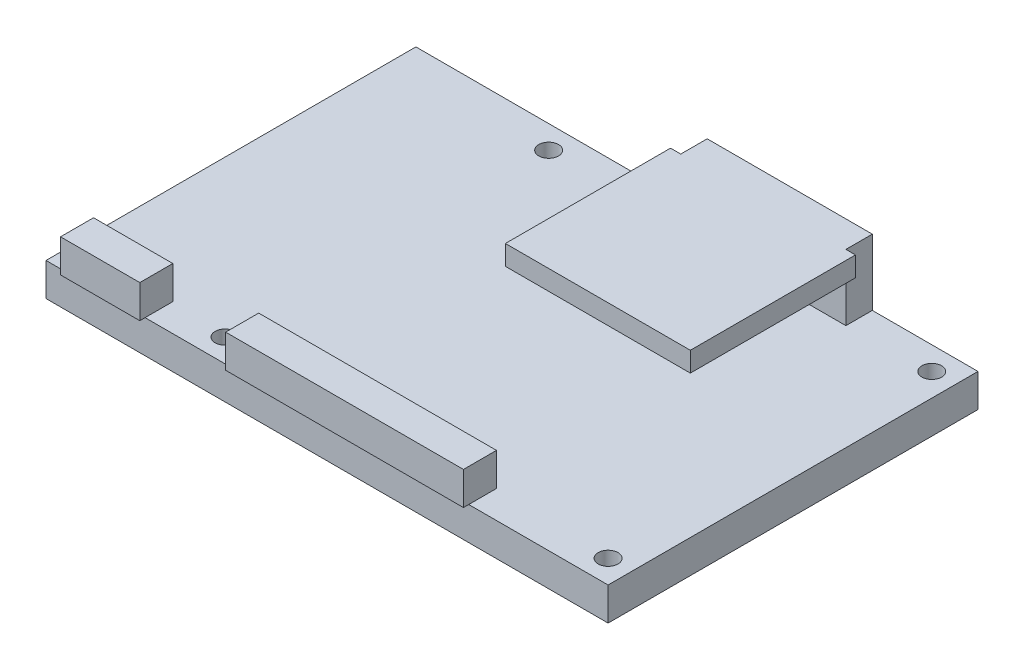
ISO-10303-21;
HEADER;
FILE_DESCRIPTION(('STEP AP214'),'2;1');
FILE_NAME('part.step','',(''),(''),'','','');
FILE_SCHEMA(('AUTOMOTIVE_DESIGN { 1 0 10303 214 1 1 1 1 }'));
ENDSEC;
DATA;
#1=APPLICATION_CONTEXT('core data for automotive mechanical design processes');
#2=APPLICATION_PROTOCOL_DEFINITION('international standard','automotive_design',2000,#1);
#3=PRODUCT_CONTEXT('',#1,'mechanical');
#4=PRODUCT('Part','Part','',(#3));
#5=PRODUCT_RELATED_PRODUCT_CATEGORY('part','',(#4));
#6=PRODUCT_DEFINITION_FORMATION('','',#4);
#7=PRODUCT_DEFINITION_CONTEXT('part definition',#1,'design');
#8=PRODUCT_DEFINITION('design','',#6,#7);
#9=PRODUCT_DEFINITION_SHAPE('','',#8);
#10=(LENGTH_UNIT() NAMED_UNIT(*) SI_UNIT(.MILLI.,.METRE.));
#11=(NAMED_UNIT(*) PLANE_ANGLE_UNIT() SI_UNIT($,.RADIAN.));
#12=(NAMED_UNIT(*) SI_UNIT($,.STERADIAN.) SOLID_ANGLE_UNIT());
#13=UNCERTAINTY_MEASURE_WITH_UNIT(LENGTH_MEASURE(1.E-05),#10,'distance_accuracy_value','');
#14=(GEOMETRIC_REPRESENTATION_CONTEXT(3) GLOBAL_UNCERTAINTY_ASSIGNED_CONTEXT((#13)) GLOBAL_UNIT_ASSIGNED_CONTEXT((#10,
#11,#12)) REPRESENTATION_CONTEXT('',''));
#15=CARTESIAN_POINT('',(0.,0.,0.));
#16=DIRECTION('',(0.,0.,1.));
#17=DIRECTION('',(1.,0.,0.));
#18=AXIS2_PLACEMENT_3D('',#15,#16,#17);
#19=CARTESIAN_POINT('',(1.55000000000002,15.,-24.));
#20=DIRECTION('',(0.,0.,-1.));
#21=DIRECTION('',(-1.,0.,0.));
#22=AXIS2_PLACEMENT_3D('',#19,#20,#21);
#23=PLANE('',#22);
#24=DIRECTION('',(1.,0.,0.));
#25=VECTOR('',#24,1.);
#26=CARTESIAN_POINT('',(0.,12.,-24.));
#27=LINE('',#26,#25);
#28=CARTESIAN_POINT('',(1.55000000000002,12.,-24.));
#29=VERTEX_POINT('',#28);
#30=CARTESIAN_POINT('',(26.55,12.,-24.));
#31=VERTEX_POINT('',#30);
#32=EDGE_CURVE('E489',#29,#31,#27,.T.);
#33=ORIENTED_EDGE('',*,*,#32,.F.);
#34=DIRECTION('',(0.,-1.,0.));
#35=VECTOR('',#34,1.);
#36=CARTESIAN_POINT('',(1.55000000000002,15.,-24.));
#37=LINE('',#36,#35);
#38=CARTESIAN_POINT('',(1.55000000000002,5.,-24.));
#39=VERTEX_POINT('',#38);
#40=EDGE_CURVE('E101',#29,#39,#37,.T.);
#41=ORIENTED_EDGE('',*,*,#40,.T.);
#42=DIRECTION('',(1.,0.,0.));
#43=VECTOR('',#42,1.);
#44=CARTESIAN_POINT('',(1.55000000000002,5.,-24.));
#45=LINE('',#44,#43);
#46=CARTESIAN_POINT('',(26.55,5.,-24.));
#47=VERTEX_POINT('',#46);
#48=EDGE_CURVE('E273',#39,#47,#45,.T.);
#49=ORIENTED_EDGE('',*,*,#48,.T.);
#50=DIRECTION('',(0.,-1.,0.));
#51=VECTOR('',#50,1.);
#52=CARTESIAN_POINT('',(26.55,15.,-24.));
#53=LINE('',#52,#51);
#54=EDGE_CURVE('E109',#31,#47,#53,.T.);
#55=ORIENTED_EDGE('',*,*,#54,.F.);
#56=EDGE_LOOP('',(#33,#41,#49,#55));
#57=FACE_BOUND('',#56,.T.);
#58=ADVANCED_FACE('F83',(#57),#23,.F.);
#59=CARTESIAN_POINT('',(0.,5.,0.));
#60=DIRECTION('',(0.,-1.,0.));
#61=DIRECTION('',(0.,0.,-1.));
#62=AXIS2_PLACEMENT_3D('',#59,#60,#61);
#63=PLANE('',#62);
#64=CARTESIAN_POINT('',(-18.9500000000002,5.,-24.5));
#65=DIRECTION('',(0.,1.,0.));
#66=DIRECTION('',(0.,0.,1.));
#67=AXIS2_PLACEMENT_3D('',#64,#65,#66);
#68=CIRCLE('',#67,1.5);
#69=CARTESIAN_POINT('',(-18.9500000000002,5.,-23.));
#70=VERTEX_POINT('',#69);
#71=EDGE_CURVE('E363',#70,#70,#68,.T.);
#72=ORIENTED_EDGE('',*,*,#71,.F.);
#73=EDGE_LOOP('',(#72));
#74=FACE_BOUND('',#73,.T.);
#75=CARTESIAN_POINT('',(39.0499999999998,5.,-24.5));
#76=DIRECTION('',(0.,1.,0.));
#77=DIRECTION('',(0.,0.,1.));
#78=AXIS2_PLACEMENT_3D('',#75,#76,#77);
#79=CIRCLE('',#78,1.5);
#80=CARTESIAN_POINT('',(39.0499999999998,5.,-23.));
#81=VERTEX_POINT('',#80);
#82=EDGE_CURVE('E369',#81,#81,#79,.T.);
#83=ORIENTED_EDGE('',*,*,#82,.F.);
#84=EDGE_LOOP('',(#83));
#85=FACE_BOUND('',#84,.T.);
#86=CARTESIAN_POINT('',(39.05,5.,24.5));
#87=DIRECTION('',(0.,1.,0.));
#88=DIRECTION('',(0.,0.,1.));
#89=AXIS2_PLACEMENT_3D('',#86,#87,#88);
#90=CIRCLE('',#89,1.5);
#91=CARTESIAN_POINT('',(39.05,5.,26.));
#92=VERTEX_POINT('',#91);
#93=EDGE_CURVE('E375',#92,#92,#90,.T.);
#94=ORIENTED_EDGE('',*,*,#93,.F.);
#95=EDGE_LOOP('',(#94));
#96=FACE_BOUND('',#95,.T.);
#97=CARTESIAN_POINT('',(-18.95,5.,24.5));
#98=DIRECTION('',(0.,1.,0.));
#99=DIRECTION('',(0.,0.,1.));
#100=AXIS2_PLACEMENT_3D('',#97,#98,#99);
#101=CIRCLE('',#100,1.5);
#102=CARTESIAN_POINT('',(-18.95,5.,26.));
#103=VERTEX_POINT('',#102);
#104=EDGE_CURVE('E381',#103,#103,#101,.T.);
#105=ORIENTED_EDGE('',*,*,#104,.F.);
#106=EDGE_LOOP('',(#105));
#107=FACE_BOUND('',#106,.T.);
#108=DIRECTION('',(0.,0.,1.));
#109=VECTOR('',#108,1.);
#110=CARTESIAN_POINT('',(1.55000000000002,5.,-28.));
#111=LINE('',#110,#109);
#112=CARTESIAN_POINT('',(1.55000000000002,5.,-28.));
#113=VERTEX_POINT('',#112);
#114=EDGE_CURVE('E270',#113,#39,#111,.T.);
#115=ORIENTED_EDGE('',*,*,#114,.F.);
#116=DIRECTION('',(-1.,0.,0.));
#117=VECTOR('',#116,1.);
#118=CARTESIAN_POINT('',(-42.55,5.,-28.));
#119=LINE('',#118,#117);
#120=CARTESIAN_POINT('',(-42.55,5.,-28.));
#121=VERTEX_POINT('',#120);
#122=EDGE_CURVE('E390',#113,#121,#119,.T.);
#123=ORIENTED_EDGE('',*,*,#122,.T.);
#124=DIRECTION('',(0.,0.,1.));
#125=VECTOR('',#124,1.);
#126=CARTESIAN_POINT('',(-42.55,5.,28.));
#127=LINE('',#126,#125);
#128=CARTESIAN_POINT('',(-42.55,5.,28.));
#129=VERTEX_POINT('',#128);
#130=EDGE_CURVE('E394',#121,#129,#127,.T.);
#131=ORIENTED_EDGE('',*,*,#130,.T.);
#132=DIRECTION('',(1.,0.,0.));
#133=VECTOR('',#132,1.);
#134=CARTESIAN_POINT('',(-42.55,5.,28.));
#135=LINE('',#134,#133);
#136=CARTESIAN_POINT('',(-39.55,5.,28.));
#137=VERTEX_POINT('',#136);
#138=EDGE_CURVE('E397',#129,#137,#135,.T.);
#139=ORIENTED_EDGE('',*,*,#138,.T.);
#140=DIRECTION('',(0.,0.,-1.));
#141=VECTOR('',#140,1.);
#142=CARTESIAN_POINT('',(-39.55,5.,28.8));
#143=LINE('',#142,#141);
#144=CARTESIAN_POINT('',(-39.55,5.,23.8));
#145=VERTEX_POINT('',#144);
#146=EDGE_CURVE('E12',#137,#145,#143,.T.);
#147=ORIENTED_EDGE('',*,*,#146,.T.);
#148=DIRECTION('',(1.,0.,0.));
#149=VECTOR('',#148,1.);
#150=CARTESIAN_POINT('',(-39.55,5.,23.8));
#151=LINE('',#150,#149);
#152=CARTESIAN_POINT('',(-27.55,5.,23.8));
#153=VERTEX_POINT('',#152);
#154=EDGE_CURVE('E346',#145,#153,#151,.T.);
#155=ORIENTED_EDGE('',*,*,#154,.T.);
#156=DIRECTION('',(0.,0.,-1.));
#157=VECTOR('',#156,1.);
#158=CARTESIAN_POINT('',(-27.55,5.,28.8));
#159=LINE('',#158,#157);
#160=CARTESIAN_POINT('',(-27.55,5.,28.));
#161=VERTEX_POINT('',#160);
#162=EDGE_CURVE('E92',#161,#153,#159,.T.);
#163=ORIENTED_EDGE('',*,*,#162,.F.);
#164=CARTESIAN_POINT('',(-14.55,5.,28.));
#165=VERTEX_POINT('',#164);
#166=EDGE_CURVE('E452',#161,#165,#135,.T.);
#167=ORIENTED_EDGE('',*,*,#166,.T.);
#168=DIRECTION('',(0.,0.,-1.));
#169=VECTOR('',#168,1.);
#170=CARTESIAN_POINT('',(-14.55,5.,28.8));
#171=LINE('',#170,#169);
#172=CARTESIAN_POINT('',(-14.55,5.,23.8));
#173=VERTEX_POINT('',#172);
#174=EDGE_CURVE('E330',#165,#173,#171,.T.);
#175=ORIENTED_EDGE('',*,*,#174,.T.);
#176=DIRECTION('',(1.,0.,0.));
#177=VECTOR('',#176,1.);
#178=CARTESIAN_POINT('',(9.45000000000001,5.,23.8));
#179=LINE('',#178,#177);
#180=CARTESIAN_POINT('',(21.45,5.,23.8));
#181=VERTEX_POINT('',#180);
#182=EDGE_CURVE('E315',#173,#181,#179,.T.);
#183=ORIENTED_EDGE('',*,*,#182,.T.);
#184=DIRECTION('',(0.,0.,-1.));
#185=VECTOR('',#184,1.);
#186=CARTESIAN_POINT('',(21.45,5.,28.8));
#187=LINE('',#186,#185);
#188=CARTESIAN_POINT('',(21.45,5.,28.));
#189=VERTEX_POINT('',#188);
#190=EDGE_CURVE('E310',#189,#181,#187,.T.);
#191=ORIENTED_EDGE('',*,*,#190,.F.);
#192=CARTESIAN_POINT('',(42.55,5.,28.));
#193=VERTEX_POINT('',#192);
#194=EDGE_CURVE('E396',#189,#193,#135,.T.);
#195=ORIENTED_EDGE('',*,*,#194,.T.);
#196=DIRECTION('',(0.,0.,-1.));
#197=VECTOR('',#196,1.);
#198=CARTESIAN_POINT('',(42.55,5.,28.));
#199=LINE('',#198,#197);
#200=CARTESIAN_POINT('',(42.55,5.,-28.));
#201=VERTEX_POINT('',#200);
#202=EDGE_CURVE('E387',#193,#201,#199,.T.);
#203=ORIENTED_EDGE('',*,*,#202,.T.);
#204=CARTESIAN_POINT('',(26.55,5.,-28.));
#205=VERTEX_POINT('',#204);
#206=EDGE_CURVE('E392',#201,#205,#119,.T.);
#207=ORIENTED_EDGE('',*,*,#206,.T.);
#208=DIRECTION('',(0.,0.,-1.));
#209=VECTOR('',#208,1.);
#210=CARTESIAN_POINT('',(26.55,5.,-28.));
#211=LINE('',#210,#209);
#212=EDGE_CURVE('E283',#47,#205,#211,.T.);
#213=ORIENTED_EDGE('',*,*,#212,.F.);
#214=ORIENTED_EDGE('',*,*,#48,.F.);
#215=EDGE_LOOP('',(#115,#123,#131,#139,#147,#155,#163,#167,#175,#183,#191,#195,#203,#207,#213,#214));
#216=FACE_BOUND('',#215,.T.);
#217=ADVANCED_FACE('F461',(#74,#85,#96,#107,#216),#63,.F.);
#218=CARTESIAN_POINT('',(0.,0.,0.));
#219=DIRECTION('',(0.,-1.,0.));
#220=DIRECTION('',(0.,0.,-1.));
#221=AXIS2_PLACEMENT_3D('',#218,#219,#220);
#222=PLANE('',#221);
#223=CARTESIAN_POINT('',(39.0499999999998,0.,-24.5));
#224=DIRECTION('',(0.,1.,0.));
#225=DIRECTION('',(0.,0.,1.));
#226=AXIS2_PLACEMENT_3D('',#223,#224,#225);
#227=CIRCLE('',#226,1.5);
#228=CARTESIAN_POINT('',(39.0499999999998,0.,-23.));
#229=VERTEX_POINT('',#228);
#230=EDGE_CURVE('E366',#229,#229,#227,.T.);
#231=ORIENTED_EDGE('',*,*,#230,.T.);
#232=EDGE_LOOP('',(#231));
#233=FACE_BOUND('',#232,.T.);
#234=CARTESIAN_POINT('',(-18.95,0.,24.5));
#235=DIRECTION('',(0.,1.,0.));
#236=DIRECTION('',(0.,0.,1.));
#237=AXIS2_PLACEMENT_3D('',#234,#235,#236);
#238=CIRCLE('',#237,1.5);
#239=CARTESIAN_POINT('',(-18.95,0.,26.));
#240=VERTEX_POINT('',#239);
#241=EDGE_CURVE('E378',#240,#240,#238,.T.);
#242=ORIENTED_EDGE('',*,*,#241,.T.);
#243=EDGE_LOOP('',(#242));
#244=FACE_BOUND('',#243,.T.);
#245=DIRECTION('',(0.,0.,-1.));
#246=VECTOR('',#245,1.);
#247=CARTESIAN_POINT('',(42.55,0.,28.));
#248=LINE('',#247,#246);
#249=CARTESIAN_POINT('',(42.55,0.,28.));
#250=VERTEX_POINT('',#249);
#251=CARTESIAN_POINT('',(42.55,0.,-28.));
#252=VERTEX_POINT('',#251);
#253=EDGE_CURVE('E384',#250,#252,#248,.T.);
#254=ORIENTED_EDGE('',*,*,#253,.F.);
#255=DIRECTION('',(1.,0.,0.));
#256=VECTOR('',#255,1.);
#257=CARTESIAN_POINT('',(-42.55,0.,28.));
#258=LINE('',#257,#256);
#259=CARTESIAN_POINT('',(-42.55,0.,28.));
#260=VERTEX_POINT('',#259);
#261=EDGE_CURVE('E391',#260,#250,#258,.T.);
#262=ORIENTED_EDGE('',*,*,#261,.F.);
#263=DIRECTION('',(0.,0.,1.));
#264=VECTOR('',#263,1.);
#265=CARTESIAN_POINT('',(-42.55,0.,28.));
#266=LINE('',#265,#264);
#267=CARTESIAN_POINT('',(-42.55,0.,-28.));
#268=VERTEX_POINT('',#267);
#269=EDGE_CURVE('E406',#268,#260,#266,.T.);
#270=ORIENTED_EDGE('',*,*,#269,.F.);
#271=DIRECTION('',(-1.,0.,0.));
#272=VECTOR('',#271,1.);
#273=CARTESIAN_POINT('',(-42.55,0.,-28.));
#274=LINE('',#273,#272);
#275=EDGE_CURVE('E404',#252,#268,#274,.T.);
#276=ORIENTED_EDGE('',*,*,#275,.F.);
#277=EDGE_LOOP('',(#254,#262,#270,#276));
#278=FACE_BOUND('',#277,.T.);
#279=CARTESIAN_POINT('',(39.05,0.,24.5));
#280=DIRECTION('',(0.,1.,0.));
#281=DIRECTION('',(0.,0.,1.));
#282=AXIS2_PLACEMENT_3D('',#279,#280,#281);
#283=CIRCLE('',#282,1.5);
#284=CARTESIAN_POINT('',(39.05,0.,26.));
#285=VERTEX_POINT('',#284);
#286=EDGE_CURVE('E372',#285,#285,#283,.T.);
#287=ORIENTED_EDGE('',*,*,#286,.T.);
#288=EDGE_LOOP('',(#287));
#289=FACE_BOUND('',#288,.T.);
#290=CARTESIAN_POINT('',(-18.9500000000002,0.,-24.5));
#291=DIRECTION('',(0.,1.,0.));
#292=DIRECTION('',(0.,0.,1.));
#293=AXIS2_PLACEMENT_3D('',#290,#291,#292);
#294=CIRCLE('',#293,1.5);
#295=CARTESIAN_POINT('',(-18.9500000000002,0.,-23.));
#296=VERTEX_POINT('',#295);
#297=EDGE_CURVE('E354',#296,#296,#294,.T.);
#298=ORIENTED_EDGE('',*,*,#297,.T.);
#299=EDGE_LOOP('',(#298));
#300=FACE_BOUND('',#299,.T.);
#301=ADVANCED_FACE('F469',(#233,#244,#278,#289,#300),#222,.T.);
#302=CARTESIAN_POINT('',(42.55,5.,28.));
#303=DIRECTION('',(-1.,0.,0.));
#304=DIRECTION('',(0.,0.,1.));
#305=AXIS2_PLACEMENT_3D('',#302,#303,#304);
#306=PLANE('',#305);
#307=ORIENTED_EDGE('',*,*,#253,.T.);
#308=DIRECTION('',(0.,-1.,0.));
#309=VECTOR('',#308,1.);
#310=CARTESIAN_POINT('',(42.55,5.,-28.));
#311=LINE('',#310,#309);
#312=EDGE_CURVE('E87',#201,#252,#311,.T.);
#313=ORIENTED_EDGE('',*,*,#312,.F.);
#314=ORIENTED_EDGE('',*,*,#202,.F.);
#315=DIRECTION('',(0.,-1.,0.));
#316=VECTOR('',#315,1.);
#317=CARTESIAN_POINT('',(42.55,5.,28.));
#318=LINE('',#317,#316);
#319=EDGE_CURVE('E400',#193,#250,#318,.T.);
#320=ORIENTED_EDGE('',*,*,#319,.T.);
#321=EDGE_LOOP('',(#307,#313,#314,#320));
#322=FACE_BOUND('',#321,.T.);
#323=ADVANCED_FACE('F85',(#322),#306,.F.);
#324=CARTESIAN_POINT('',(-42.55,5.,-28.));
#325=DIRECTION('',(0.,0.,1.));
#326=DIRECTION('',(1.,0.,0.));
#327=AXIS2_PLACEMENT_3D('',#324,#325,#326);
#328=PLANE('',#327);
#329=ORIENTED_EDGE('',*,*,#275,.T.);
#330=DIRECTION('',(0.,-1.,0.));
#331=VECTOR('',#330,1.);
#332=CARTESIAN_POINT('',(-42.55,5.,-28.));
#333=LINE('',#332,#331);
#334=EDGE_CURVE('E413',#121,#268,#333,.T.);
#335=ORIENTED_EDGE('',*,*,#334,.F.);
#336=ORIENTED_EDGE('',*,*,#122,.F.);
#337=DIRECTION('',(0.,-1.,0.));
#338=VECTOR('',#337,1.);
#339=CARTESIAN_POINT('',(1.55000000000002,15.,-28.));
#340=LINE('',#339,#338);
#341=CARTESIAN_POINT('',(1.55000000000002,15.,-28.));
#342=VERTEX_POINT('',#341);
#343=EDGE_CURVE('E286',#342,#113,#340,.T.);
#344=ORIENTED_EDGE('',*,*,#343,.F.);
#345=DIRECTION('',(-1.,0.,0.));
#346=VECTOR('',#345,1.);
#347=CARTESIAN_POINT('',(1.55000000000002,15.,-28.));
#348=LINE('',#347,#346);
#349=CARTESIAN_POINT('',(26.55,15.,-28.));
#350=VERTEX_POINT('',#349);
#351=EDGE_CURVE('E285',#350,#342,#348,.T.);
#352=ORIENTED_EDGE('',*,*,#351,.F.);
#353=DIRECTION('',(0.,-1.,0.));
#354=VECTOR('',#353,1.);
#355=CARTESIAN_POINT('',(26.55,15.,-28.));
#356=LINE('',#355,#354);
#357=EDGE_CURVE('E292',#350,#205,#356,.T.);
#358=ORIENTED_EDGE('',*,*,#357,.T.);
#359=ORIENTED_EDGE('',*,*,#206,.F.);
#360=ORIENTED_EDGE('',*,*,#312,.T.);
#361=EDGE_LOOP('',(#329,#335,#336,#344,#352,#358,#359,#360));
#362=FACE_BOUND('',#361,.T.);
#363=ADVANCED_FACE('F471',(#362),#328,.F.);
#364=CARTESIAN_POINT('',(-42.55,5.,28.));
#365=DIRECTION('',(1.,0.,0.));
#366=DIRECTION('',(0.,0.,-1.));
#367=AXIS2_PLACEMENT_3D('',#364,#365,#366);
#368=PLANE('',#367);
#369=ORIENTED_EDGE('',*,*,#269,.T.);
#370=DIRECTION('',(0.,-1.,0.));
#371=VECTOR('',#370,1.);
#372=CARTESIAN_POINT('',(-42.55,5.,28.));
#373=LINE('',#372,#371);
#374=EDGE_CURVE('E411',#129,#260,#373,.T.);
#375=ORIENTED_EDGE('',*,*,#374,.F.);
#376=ORIENTED_EDGE('',*,*,#130,.F.);
#377=ORIENTED_EDGE('',*,*,#334,.T.);
#378=EDGE_LOOP('',(#369,#375,#376,#377));
#379=FACE_BOUND('',#378,.T.);
#380=ADVANCED_FACE('F474',(#379),#368,.F.);
#381=CARTESIAN_POINT('',(-42.55,5.,28.));
#382=DIRECTION('',(0.,0.,-1.));
#383=DIRECTION('',(-1.,0.,0.));
#384=AXIS2_PLACEMENT_3D('',#381,#382,#383);
#385=PLANE('',#384);
#386=ORIENTED_EDGE('',*,*,#261,.T.);
#387=ORIENTED_EDGE('',*,*,#319,.F.);
#388=ORIENTED_EDGE('',*,*,#194,.F.);
#389=EDGE_CURVE('E453',#165,#189,#135,.T.);
#390=ORIENTED_EDGE('',*,*,#389,.F.);
#391=ORIENTED_EDGE('',*,*,#166,.F.);
#392=EDGE_CURVE('E401',#137,#161,#135,.T.);
#393=ORIENTED_EDGE('',*,*,#392,.F.);
#394=ORIENTED_EDGE('',*,*,#138,.F.);
#395=ORIENTED_EDGE('',*,*,#374,.T.);
#396=EDGE_LOOP('',(#386,#387,#388,#390,#391,#393,#394,#395));
#397=FACE_BOUND('',#396,.T.);
#398=ADVANCED_FACE('F464',(#397),#385,.F.);
#399=CARTESIAN_POINT('',(-18.95,5.,24.5));
#400=DIRECTION('',(0.,-1.,0.));
#401=DIRECTION('',(0.,0.,-1.));
#402=AXIS2_PLACEMENT_3D('',#399,#400,#401);
#403=CYLINDRICAL_SURFACE('',#402,1.5);
#404=ORIENTED_EDGE('',*,*,#104,.T.);
#405=EDGE_LOOP('',(#404));
#406=FACE_BOUND('',#405,.T.);
#407=ORIENTED_EDGE('',*,*,#241,.F.);
#408=EDGE_LOOP('',(#407));
#409=FACE_BOUND('',#408,.T.);
#410=ADVANCED_FACE('F575',(#406,#409),#403,.F.);
#411=CARTESIAN_POINT('',(39.05,5.,24.5));
#412=DIRECTION('',(0.,-1.,0.));
#413=DIRECTION('',(0.,0.,-1.));
#414=AXIS2_PLACEMENT_3D('',#411,#412,#413);
#415=CYLINDRICAL_SURFACE('',#414,1.5);
#416=ORIENTED_EDGE('',*,*,#93,.T.);
#417=EDGE_LOOP('',(#416));
#418=FACE_BOUND('',#417,.T.);
#419=ORIENTED_EDGE('',*,*,#286,.F.);
#420=EDGE_LOOP('',(#419));
#421=FACE_BOUND('',#420,.T.);
#422=ADVANCED_FACE('F571',(#418,#421),#415,.F.);
#423=CARTESIAN_POINT('',(39.0499999999998,5.,-24.5));
#424=DIRECTION('',(0.,-1.,0.));
#425=DIRECTION('',(0.,0.,-1.));
#426=AXIS2_PLACEMENT_3D('',#423,#424,#425);
#427=CYLINDRICAL_SURFACE('',#426,1.5);
#428=ORIENTED_EDGE('',*,*,#82,.T.);
#429=EDGE_LOOP('',(#428));
#430=FACE_BOUND('',#429,.T.);
#431=ORIENTED_EDGE('',*,*,#230,.F.);
#432=EDGE_LOOP('',(#431));
#433=FACE_BOUND('',#432,.T.);
#434=ADVANCED_FACE('F567',(#430,#433),#427,.F.);
#435=CARTESIAN_POINT('',(-18.9500000000002,5.,-24.5));
#436=DIRECTION('',(0.,-1.,0.));
#437=DIRECTION('',(0.,0.,-1.));
#438=AXIS2_PLACEMENT_3D('',#435,#436,#437);
#439=CYLINDRICAL_SURFACE('',#438,1.5);
#440=ORIENTED_EDGE('',*,*,#71,.T.);
#441=EDGE_LOOP('',(#440));
#442=FACE_BOUND('',#441,.T.);
#443=ORIENTED_EDGE('',*,*,#297,.F.);
#444=EDGE_LOOP('',(#443));
#445=FACE_BOUND('',#444,.T.);
#446=ADVANCED_FACE('F564',(#442,#445),#439,.F.);
#447=CARTESIAN_POINT('',(-39.55,10.,28.8));
#448=DIRECTION('',(-1.,0.,0.));
#449=DIRECTION('',(0.,0.,1.));
#450=AXIS2_PLACEMENT_3D('',#447,#448,#449);
#451=PLANE('',#450);
#452=CARTESIAN_POINT('',(-39.55,5.,28.8));
#453=VERTEX_POINT('',#452);
#454=EDGE_CURVE('E94',#453,#137,#143,.T.);
#455=ORIENTED_EDGE('',*,*,#454,.F.);
#456=DIRECTION('',(0.,-1.,0.));
#457=VECTOR('',#456,1.);
#458=CARTESIAN_POINT('',(-39.55,10.,28.8));
#459=LINE('',#458,#457);
#460=CARTESIAN_POINT('',(-39.55,10.,28.8));
#461=VERTEX_POINT('',#460);
#462=EDGE_CURVE('E352',#461,#453,#459,.T.);
#463=ORIENTED_EDGE('',*,*,#462,.F.);
#464=DIRECTION('',(0.,0.,-1.));
#465=VECTOR('',#464,1.);
#466=CARTESIAN_POINT('',(-39.55,10.,28.8));
#467=LINE('',#466,#465);
#468=CARTESIAN_POINT('',(-39.55,10.,23.8));
#469=VERTEX_POINT('',#468);
#470=EDGE_CURVE('E333',#461,#469,#467,.T.);
#471=ORIENTED_EDGE('',*,*,#470,.T.);
#472=DIRECTION('',(0.,-1.,0.));
#473=VECTOR('',#472,1.);
#474=CARTESIAN_POINT('',(-39.55,10.,23.8));
#475=LINE('',#474,#473);
#476=EDGE_CURVE('E343',#469,#145,#475,.T.);
#477=ORIENTED_EDGE('',*,*,#476,.T.);
#478=ORIENTED_EDGE('',*,*,#146,.F.);
#479=EDGE_LOOP('',(#455,#463,#471,#477,#478));
#480=FACE_BOUND('',#479,.T.);
#481=ADVANCED_FACE('F440',(#480),#451,.T.);
#482=CARTESIAN_POINT('',(-39.55,10.,28.8));
#483=DIRECTION('',(0.,0.,-1.));
#484=DIRECTION('',(-1.,0.,0.));
#485=AXIS2_PLACEMENT_3D('',#482,#483,#484);
#486=PLANE('',#485);
#487=DIRECTION('',(1.,0.,0.));
#488=VECTOR('',#487,1.);
#489=CARTESIAN_POINT('',(-39.55,5.,28.8));
#490=LINE('',#489,#488);
#491=CARTESIAN_POINT('',(-27.55,5.,28.8));
#492=VERTEX_POINT('',#491);
#493=EDGE_CURVE('E337',#453,#492,#490,.T.);
#494=ORIENTED_EDGE('',*,*,#493,.T.);
#495=DIRECTION('',(0.,-1.,0.));
#496=VECTOR('',#495,1.);
#497=CARTESIAN_POINT('',(-27.55,10.,28.8));
#498=LINE('',#497,#496);
#499=CARTESIAN_POINT('',(-27.55,10.,28.8));
#500=VERTEX_POINT('',#499);
#501=EDGE_CURVE('E355',#500,#492,#498,.T.);
#502=ORIENTED_EDGE('',*,*,#501,.F.);
#503=DIRECTION('',(1.,0.,0.));
#504=VECTOR('',#503,1.);
#505=CARTESIAN_POINT('',(-39.55,10.,28.8));
#506=LINE('',#505,#504);
#507=EDGE_CURVE('E342',#461,#500,#506,.T.);
#508=ORIENTED_EDGE('',*,*,#507,.F.);
#509=ORIENTED_EDGE('',*,*,#462,.T.);
#510=EDGE_LOOP('',(#494,#502,#508,#509));
#511=FACE_BOUND('',#510,.T.);
#512=ADVANCED_FACE('F446',(#511),#486,.F.);
#513=CARTESIAN_POINT('',(-27.55,10.,28.8));
#514=DIRECTION('',(-1.,0.,0.));
#515=DIRECTION('',(0.,0.,1.));
#516=AXIS2_PLACEMENT_3D('',#513,#514,#515);
#517=PLANE('',#516);
#518=EDGE_CURVE('E348',#492,#161,#159,.T.);
#519=ORIENTED_EDGE('',*,*,#518,.T.);
#520=ORIENTED_EDGE('',*,*,#162,.T.);
#521=DIRECTION('',(0.,-1.,0.));
#522=VECTOR('',#521,1.);
#523=CARTESIAN_POINT('',(-27.55,10.,23.8));
#524=LINE('',#523,#522);
#525=CARTESIAN_POINT('',(-27.55,10.,23.8));
#526=VERTEX_POINT('',#525);
#527=EDGE_CURVE('E358',#526,#153,#524,.T.);
#528=ORIENTED_EDGE('',*,*,#527,.F.);
#529=DIRECTION('',(0.,0.,-1.));
#530=VECTOR('',#529,1.);
#531=CARTESIAN_POINT('',(-27.55,10.,28.8));
#532=LINE('',#531,#530);
#533=EDGE_CURVE('E340',#500,#526,#532,.T.);
#534=ORIENTED_EDGE('',*,*,#533,.F.);
#535=ORIENTED_EDGE('',*,*,#501,.T.);
#536=EDGE_LOOP('',(#519,#520,#528,#534,#535));
#537=FACE_BOUND('',#536,.T.);
#538=ADVANCED_FACE('F425',(#537),#517,.F.);
#539=CARTESIAN_POINT('',(-39.55,10.,23.8));
#540=DIRECTION('',(0.,0.,-1.));
#541=DIRECTION('',(-1.,0.,0.));
#542=AXIS2_PLACEMENT_3D('',#539,#540,#541);
#543=PLANE('',#542);
#544=ORIENTED_EDGE('',*,*,#154,.F.);
#545=ORIENTED_EDGE('',*,*,#476,.F.);
#546=DIRECTION('',(1.,0.,0.));
#547=VECTOR('',#546,1.);
#548=CARTESIAN_POINT('',(-39.55,10.,23.8));
#549=LINE('',#548,#547);
#550=EDGE_CURVE('E336',#469,#526,#549,.T.);
#551=ORIENTED_EDGE('',*,*,#550,.T.);
#552=ORIENTED_EDGE('',*,*,#527,.T.);
#553=EDGE_LOOP('',(#544,#545,#551,#552));
#554=FACE_BOUND('',#553,.T.);
#555=ADVANCED_FACE('F433',(#554),#543,.T.);
#556=CARTESIAN_POINT('',(0.,10.,0.));
#557=DIRECTION('',(0.,-1.,0.));
#558=DIRECTION('',(0.,0.,-1.));
#559=AXIS2_PLACEMENT_3D('',#556,#557,#558);
#560=PLANE('',#559);
#561=ORIENTED_EDGE('',*,*,#470,.F.);
#562=ORIENTED_EDGE('',*,*,#507,.T.);
#563=ORIENTED_EDGE('',*,*,#533,.T.);
#564=ORIENTED_EDGE('',*,*,#550,.F.);
#565=EDGE_LOOP('',(#561,#562,#563,#564));
#566=FACE_BOUND('',#565,.T.);
#567=ADVANCED_FACE('F437',(#566),#560,.F.);
#568=CARTESIAN_POINT('',(0.,5.,0.));
#569=DIRECTION('',(0.,-1.,0.));
#570=DIRECTION('',(0.,0.,-1.));
#571=AXIS2_PLACEMENT_3D('',#568,#569,#570);
#572=PLANE('',#571);
#573=ORIENTED_EDGE('',*,*,#454,.T.);
#574=ORIENTED_EDGE('',*,*,#392,.T.);
#575=ORIENTED_EDGE('',*,*,#518,.F.);
#576=ORIENTED_EDGE('',*,*,#493,.F.);
#577=EDGE_LOOP('',(#573,#574,#575,#576));
#578=FACE_BOUND('',#577,.T.);
#579=ADVANCED_FACE('F449',(#578),#572,.T.);
#580=CARTESIAN_POINT('',(0.,5.,0.));
#581=DIRECTION('',(0.,-1.,0.));
#582=DIRECTION('',(0.,0.,-1.));
#583=AXIS2_PLACEMENT_3D('',#580,#581,#582);
#584=PLANE('',#583);
#585=ORIENTED_EDGE('',*,*,#389,.T.);
#586=CARTESIAN_POINT('',(21.45,5.,28.8));
#587=VERTEX_POINT('',#586);
#588=EDGE_CURVE('E312',#587,#189,#187,.T.);
#589=ORIENTED_EDGE('',*,*,#588,.F.);
#590=DIRECTION('',(1.,0.,0.));
#591=VECTOR('',#590,1.);
#592=CARTESIAN_POINT('',(9.45000000000001,5.,28.8));
#593=LINE('',#592,#591);
#594=CARTESIAN_POINT('',(-14.55,5.,28.8));
#595=VERTEX_POINT('',#594);
#596=EDGE_CURVE('E308',#595,#587,#593,.T.);
#597=ORIENTED_EDGE('',*,*,#596,.F.);
#598=EDGE_CURVE('E307',#595,#165,#171,.T.);
#599=ORIENTED_EDGE('',*,*,#598,.T.);
#600=EDGE_LOOP('',(#585,#589,#597,#599));
#601=FACE_BOUND('',#600,.T.);
#602=ADVANCED_FACE('F535',(#601),#584,.T.);
#603=CARTESIAN_POINT('',(-14.55,10.,28.8));
#604=DIRECTION('',(-1.,0.,0.));
#605=DIRECTION('',(0.,0.,1.));
#606=AXIS2_PLACEMENT_3D('',#603,#604,#605);
#607=PLANE('',#606);
#608=ORIENTED_EDGE('',*,*,#598,.F.);
#609=DIRECTION('',(0.,-1.,0.));
#610=VECTOR('',#609,1.);
#611=CARTESIAN_POINT('',(-14.55,10.,28.8));
#612=LINE('',#611,#610);
#613=CARTESIAN_POINT('',(-14.55,10.,28.8));
#614=VERTEX_POINT('',#613);
#615=EDGE_CURVE('E299',#614,#595,#612,.T.);
#616=ORIENTED_EDGE('',*,*,#615,.F.);
#617=DIRECTION('',(0.,0.,-1.));
#618=VECTOR('',#617,1.);
#619=CARTESIAN_POINT('',(-14.55,10.,28.8));
#620=LINE('',#619,#618);
#621=CARTESIAN_POINT('',(-14.55,10.,23.8));
#622=VERTEX_POINT('',#621);
#623=EDGE_CURVE('E325',#614,#622,#620,.T.);
#624=ORIENTED_EDGE('',*,*,#623,.T.);
#625=DIRECTION('',(0.,-1.,0.));
#626=VECTOR('',#625,1.);
#627=CARTESIAN_POINT('',(-14.55,10.,23.8));
#628=LINE('',#627,#626);
#629=EDGE_CURVE('E322',#622,#173,#628,.T.);
#630=ORIENTED_EDGE('',*,*,#629,.T.);
#631=ORIENTED_EDGE('',*,*,#174,.F.);
#632=EDGE_LOOP('',(#608,#616,#624,#630,#631));
#633=FACE_BOUND('',#632,.T.);
#634=ADVANCED_FACE('F534',(#633),#607,.T.);
#635=CARTESIAN_POINT('',(-14.55,10.,28.8));
#636=DIRECTION('',(0.,0.,-1.));
#637=DIRECTION('',(-1.,0.,0.));
#638=AXIS2_PLACEMENT_3D('',#635,#636,#637);
#639=PLANE('',#638);
#640=ORIENTED_EDGE('',*,*,#615,.T.);
#641=ORIENTED_EDGE('',*,*,#596,.T.);
#642=DIRECTION('',(0.,-1.,0.));
#643=VECTOR('',#642,1.);
#644=CARTESIAN_POINT('',(21.45,10.,28.8));
#645=LINE('',#644,#643);
#646=CARTESIAN_POINT('',(21.45,10.,28.8));
#647=VERTEX_POINT('',#646);
#648=EDGE_CURVE('E304',#647,#587,#645,.T.);
#649=ORIENTED_EDGE('',*,*,#648,.F.);
#650=DIRECTION('',(1.,0.,0.));
#651=VECTOR('',#650,1.);
#652=CARTESIAN_POINT('',(9.45000000000001,10.,28.8));
#653=LINE('',#652,#651);
#654=EDGE_CURVE('E303',#614,#647,#653,.T.);
#655=ORIENTED_EDGE('',*,*,#654,.F.);
#656=EDGE_LOOP('',(#640,#641,#649,#655));
#657=FACE_BOUND('',#656,.T.);
#658=ADVANCED_FACE('F538',(#657),#639,.F.);
#659=CARTESIAN_POINT('',(-14.55,10.,23.8));
#660=DIRECTION('',(0.,0.,-1.));
#661=DIRECTION('',(-1.,0.,0.));
#662=AXIS2_PLACEMENT_3D('',#659,#660,#661);
#663=PLANE('',#662);
#664=ORIENTED_EDGE('',*,*,#182,.F.);
#665=ORIENTED_EDGE('',*,*,#629,.F.);
#666=DIRECTION('',(1.,0.,0.));
#667=VECTOR('',#666,1.);
#668=CARTESIAN_POINT('',(9.45000000000001,10.,23.8));
#669=LINE('',#668,#667);
#670=CARTESIAN_POINT('',(21.45,10.,23.8));
#671=VERTEX_POINT('',#670);
#672=EDGE_CURVE('E311',#622,#671,#669,.T.);
#673=ORIENTED_EDGE('',*,*,#672,.T.);
#674=DIRECTION('',(0.,-1.,0.));
#675=VECTOR('',#674,1.);
#676=CARTESIAN_POINT('',(21.45,10.,23.8));
#677=LINE('',#676,#675);
#678=EDGE_CURVE('E300',#671,#181,#677,.T.);
#679=ORIENTED_EDGE('',*,*,#678,.T.);
#680=EDGE_LOOP('',(#664,#665,#673,#679));
#681=FACE_BOUND('',#680,.T.);
#682=ADVANCED_FACE('F540',(#681),#663,.T.);
#683=CARTESIAN_POINT('',(0.,10.,0.));
#684=DIRECTION('',(0.,-1.,0.));
#685=DIRECTION('',(0.,0.,-1.));
#686=AXIS2_PLACEMENT_3D('',#683,#684,#685);
#687=PLANE('',#686);
#688=ORIENTED_EDGE('',*,*,#623,.F.);
#689=ORIENTED_EDGE('',*,*,#654,.T.);
#690=DIRECTION('',(0.,0.,-1.));
#691=VECTOR('',#690,1.);
#692=CARTESIAN_POINT('',(21.45,10.,28.8));
#693=LINE('',#692,#691);
#694=EDGE_CURVE('E318',#647,#671,#693,.T.);
#695=ORIENTED_EDGE('',*,*,#694,.T.);
#696=ORIENTED_EDGE('',*,*,#672,.F.);
#697=EDGE_LOOP('',(#688,#689,#695,#696));
#698=FACE_BOUND('',#697,.T.);
#699=ADVANCED_FACE('F530',(#698),#687,.F.);
#700=CARTESIAN_POINT('',(21.45,10.,28.8));
#701=DIRECTION('',(-1.,0.,0.));
#702=DIRECTION('',(0.,0.,1.));
#703=AXIS2_PLACEMENT_3D('',#700,#701,#702);
#704=PLANE('',#703);
#705=ORIENTED_EDGE('',*,*,#588,.T.);
#706=ORIENTED_EDGE('',*,*,#190,.T.);
#707=ORIENTED_EDGE('',*,*,#678,.F.);
#708=ORIENTED_EDGE('',*,*,#694,.F.);
#709=ORIENTED_EDGE('',*,*,#648,.T.);
#710=EDGE_LOOP('',(#705,#706,#707,#708,#709));
#711=FACE_BOUND('',#710,.T.);
#712=ADVANCED_FACE('F529',(#711),#704,.F.);
#713=CARTESIAN_POINT('',(1.55000000000002,15.,-28.));
#714=DIRECTION('',(1.,0.,0.));
#715=DIRECTION('',(0.,0.,-1.));
#716=AXIS2_PLACEMENT_3D('',#713,#714,#715);
#717=PLANE('',#716);
#718=ORIENTED_EDGE('',*,*,#114,.T.);
#719=ORIENTED_EDGE('',*,*,#40,.F.);
#720=CARTESIAN_POINT('',(1.55000000000002,15.,-24.));
#721=VERTEX_POINT('',#720);
#722=EDGE_CURVE('E297',#721,#29,#37,.T.);
#723=ORIENTED_EDGE('',*,*,#722,.F.);
#724=DIRECTION('',(0.,0.,1.));
#725=VECTOR('',#724,1.);
#726=CARTESIAN_POINT('',(1.55000000000002,15.,-28.));
#727=LINE('',#726,#725);
#728=EDGE_CURVE('E279',#342,#721,#727,.T.);
#729=ORIENTED_EDGE('',*,*,#728,.F.);
#730=ORIENTED_EDGE('',*,*,#343,.T.);
#731=EDGE_LOOP('',(#718,#719,#723,#729,#730));
#732=FACE_BOUND('',#731,.T.);
#733=ADVANCED_FACE('F477',(#732),#717,.F.);
#734=CARTESIAN_POINT('',(26.55,15.,-28.));
#735=DIRECTION('',(-1.,0.,0.));
#736=DIRECTION('',(0.,0.,1.));
#737=AXIS2_PLACEMENT_3D('',#734,#735,#736);
#738=PLANE('',#737);
#739=ORIENTED_EDGE('',*,*,#212,.T.);
#740=ORIENTED_EDGE('',*,*,#357,.F.);
#741=DIRECTION('',(0.,0.,-1.));
#742=VECTOR('',#741,1.);
#743=CARTESIAN_POINT('',(26.55,15.,-28.));
#744=LINE('',#743,#742);
#745=CARTESIAN_POINT('',(26.55,15.,-24.));
#746=VERTEX_POINT('',#745);
#747=EDGE_CURVE('E282',#746,#350,#744,.T.);
#748=ORIENTED_EDGE('',*,*,#747,.F.);
#749=EDGE_CURVE('E295',#746,#31,#53,.T.);
#750=ORIENTED_EDGE('',*,*,#749,.T.);
#751=ORIENTED_EDGE('',*,*,#54,.T.);
#752=EDGE_LOOP('',(#739,#740,#748,#750,#751));
#753=FACE_BOUND('',#752,.T.);
#754=ADVANCED_FACE('F487',(#753),#738,.F.);
#755=CARTESIAN_POINT('',(0.,15.,0.));
#756=DIRECTION('',(0.,1.,0.));
#757=DIRECTION('',(0.,0.,1.));
#758=AXIS2_PLACEMENT_3D('',#755,#756,#757);
#759=PLANE('',#758);
#760=ORIENTED_EDGE('',*,*,#728,.T.);
#761=DIRECTION('',(-1.,0.,0.));
#762=VECTOR('',#761,1.);
#763=CARTESIAN_POINT('',(0.,15.,-24.));
#764=LINE('',#763,#762);
#765=CARTESIAN_POINT('',(0.,15.,-24.));
#766=VERTEX_POINT('',#765);
#767=EDGE_CURVE('E501',#721,#766,#764,.T.);
#768=ORIENTED_EDGE('',*,*,#767,.T.);
#769=DIRECTION('',(0.,0.,-1.));
#770=VECTOR('',#769,1.);
#771=CARTESIAN_POINT('',(0.,15.,1.));
#772=LINE('',#771,#770);
#773=CARTESIAN_POINT('',(0.,15.,1.));
#774=VERTEX_POINT('',#773);
#775=EDGE_CURVE('E503',#774,#766,#772,.T.);
#776=ORIENTED_EDGE('',*,*,#775,.F.);
#777=DIRECTION('',(-1.,0.,0.));
#778=VECTOR('',#777,1.);
#779=CARTESIAN_POINT('',(0.,15.,1.));
#780=LINE('',#779,#778);
#781=CARTESIAN_POINT('',(28.,15.,1.));
#782=VERTEX_POINT('',#781);
#783=EDGE_CURVE('E261',#782,#774,#780,.T.);
#784=ORIENTED_EDGE('',*,*,#783,.F.);
#785=DIRECTION('',(0.,0.,-1.));
#786=VECTOR('',#785,1.);
#787=CARTESIAN_POINT('',(28.,15.,1.));
#788=LINE('',#787,#786);
#789=CARTESIAN_POINT('',(28.,15.,-24.));
#790=VERTEX_POINT('',#789);
#791=EDGE_CURVE('E275',#782,#790,#788,.T.);
#792=ORIENTED_EDGE('',*,*,#791,.T.);
#793=EDGE_CURVE('E265',#790,#746,#764,.T.);
#794=ORIENTED_EDGE('',*,*,#793,.T.);
#795=ORIENTED_EDGE('',*,*,#747,.T.);
#796=ORIENTED_EDGE('',*,*,#351,.T.);
#797=EDGE_LOOP('',(#760,#768,#776,#784,#792,#794,#795,#796));
#798=FACE_BOUND('',#797,.T.);
#799=ADVANCED_FACE('F482',(#798),#759,.T.);
#800=CARTESIAN_POINT('',(0.,0.,-24.));
#801=DIRECTION('',(0.,0.,1.));
#802=DIRECTION('',(1.,0.,0.));
#803=AXIS2_PLACEMENT_3D('',#800,#801,#802);
#804=PLANE('',#803);
#805=ORIENTED_EDGE('',*,*,#767,.F.);
#806=ORIENTED_EDGE('',*,*,#722,.T.);
#807=CARTESIAN_POINT('',(0.,12.,-24.));
#808=VERTEX_POINT('',#807);
#809=EDGE_CURVE('E496',#808,#29,#27,.T.);
#810=ORIENTED_EDGE('',*,*,#809,.F.);
#811=DIRECTION('',(0.,-1.,0.));
#812=VECTOR('',#811,1.);
#813=CARTESIAN_POINT('',(0.,15.,-24.));
#814=LINE('',#813,#812);
#815=EDGE_CURVE('E269',#766,#808,#814,.T.);
#816=ORIENTED_EDGE('',*,*,#815,.F.);
#817=EDGE_LOOP('',(#805,#806,#810,#816));
#818=FACE_BOUND('',#817,.T.);
#819=ADVANCED_FACE('F637',(#818),#804,.F.);
#820=CARTESIAN_POINT('',(28.,12.,-24.));
#821=VERTEX_POINT('',#820);
#822=EDGE_CURVE('E493',#31,#821,#27,.T.);
#823=ORIENTED_EDGE('',*,*,#822,.F.);
#824=ORIENTED_EDGE('',*,*,#749,.F.);
#825=ORIENTED_EDGE('',*,*,#793,.F.);
#826=DIRECTION('',(0.,1.,0.));
#827=VECTOR('',#826,1.);
#828=CARTESIAN_POINT('',(28.,15.,-24.));
#829=LINE('',#828,#827);
#830=EDGE_CURVE('E494',#821,#790,#829,.T.);
#831=ORIENTED_EDGE('',*,*,#830,.F.);
#832=EDGE_LOOP('',(#823,#824,#825,#831));
#833=FACE_BOUND('',#832,.T.);
#834=ADVANCED_FACE('F491',(#833),#804,.F.);
#835=CARTESIAN_POINT('',(0.,15.,1.));
#836=DIRECTION('',(1.,0.,0.));
#837=DIRECTION('',(0.,0.,-1.));
#838=AXIS2_PLACEMENT_3D('',#835,#836,#837);
#839=PLANE('',#838);
#840=ORIENTED_EDGE('',*,*,#815,.T.);
#841=DIRECTION('',(0.,0.,-1.));
#842=VECTOR('',#841,1.);
#843=CARTESIAN_POINT('',(0.,12.,1.));
#844=LINE('',#843,#842);
#845=CARTESIAN_POINT('',(0.,12.,1.));
#846=VERTEX_POINT('',#845);
#847=EDGE_CURVE('E249',#846,#808,#844,.T.);
#848=ORIENTED_EDGE('',*,*,#847,.F.);
#849=DIRECTION('',(0.,-1.,0.));
#850=VECTOR('',#849,1.);
#851=CARTESIAN_POINT('',(0.,15.,1.));
#852=LINE('',#851,#850);
#853=EDGE_CURVE('E256',#774,#846,#852,.T.);
#854=ORIENTED_EDGE('',*,*,#853,.F.);
#855=ORIENTED_EDGE('',*,*,#775,.T.);
#856=EDGE_LOOP('',(#840,#848,#854,#855));
#857=FACE_BOUND('',#856,.T.);
#858=ADVANCED_FACE('F267',(#857),#839,.F.);
#859=CARTESIAN_POINT('',(0.,12.,1.));
#860=DIRECTION('',(0.,1.,0.));
#861=DIRECTION('',(0.,0.,1.));
#862=AXIS2_PLACEMENT_3D('',#859,#860,#861);
#863=PLANE('',#862);
#864=ORIENTED_EDGE('',*,*,#809,.T.);
#865=ORIENTED_EDGE('',*,*,#32,.T.);
#866=ORIENTED_EDGE('',*,*,#822,.T.);
#867=DIRECTION('',(0.,0.,-1.));
#868=VECTOR('',#867,1.);
#869=CARTESIAN_POINT('',(28.,12.,1.));
#870=LINE('',#869,#868);
#871=CARTESIAN_POINT('',(28.,12.,1.));
#872=VERTEX_POINT('',#871);
#873=EDGE_CURVE('E252',#872,#821,#870,.T.);
#874=ORIENTED_EDGE('',*,*,#873,.F.);
#875=DIRECTION('',(1.,0.,0.));
#876=VECTOR('',#875,1.);
#877=CARTESIAN_POINT('',(0.,12.,1.));
#878=LINE('',#877,#876);
#879=EDGE_CURVE('E244',#846,#872,#878,.T.);
#880=ORIENTED_EDGE('',*,*,#879,.F.);
#881=ORIENTED_EDGE('',*,*,#847,.T.);
#882=EDGE_LOOP('',(#864,#865,#866,#874,#880,#881));
#883=FACE_BOUND('',#882,.T.);
#884=ADVANCED_FACE('F247',(#883),#863,.F.);
#885=CARTESIAN_POINT('',(28.,15.,1.));
#886=DIRECTION('',(-1.,0.,0.));
#887=DIRECTION('',(0.,0.,1.));
#888=AXIS2_PLACEMENT_3D('',#885,#886,#887);
#889=PLANE('',#888);
#890=ORIENTED_EDGE('',*,*,#830,.T.);
#891=ORIENTED_EDGE('',*,*,#791,.F.);
#892=DIRECTION('',(0.,1.,0.));
#893=VECTOR('',#892,1.);
#894=CARTESIAN_POINT('',(28.,15.,1.));
#895=LINE('',#894,#893);
#896=EDGE_CURVE('E255',#872,#782,#895,.T.);
#897=ORIENTED_EDGE('',*,*,#896,.F.);
#898=ORIENTED_EDGE('',*,*,#873,.T.);
#899=EDGE_LOOP('',(#890,#891,#897,#898));
#900=FACE_BOUND('',#899,.T.);
#901=ADVANCED_FACE('F506',(#900),#889,.F.);
#902=CARTESIAN_POINT('',(0.,0.,1.));
#903=DIRECTION('',(0.,0.,1.));
#904=DIRECTION('',(1.,0.,0.));
#905=AXIS2_PLACEMENT_3D('',#902,#903,#904);
#906=PLANE('',#905);
#907=ORIENTED_EDGE('',*,*,#853,.T.);
#908=ORIENTED_EDGE('',*,*,#879,.T.);
#909=ORIENTED_EDGE('',*,*,#896,.T.);
#910=ORIENTED_EDGE('',*,*,#783,.T.);
#911=EDGE_LOOP('',(#907,#908,#909,#910));
#912=FACE_BOUND('',#911,.T.);
#913=ADVANCED_FACE('F259',(#912),#906,.T.);
#914=CLOSED_SHELL('',(#58,#217,#301,#323,#363,#380,#398,#410,#422,#434,#446,#481,#512,#538,#555,
#567,#579,#602,#634,#658,#682,#699,#712,#733,#754,#799,#819,#834,#858,#884,#901,#913));
#915=MANIFOLD_SOLID_BREP('B2',#914);
#916=ADVANCED_BREP_SHAPE_REPRESENTATION('',(#18,#915),#14);
#917=SHAPE_DEFINITION_REPRESENTATION(#9,#916);
ENDSEC;
END-ISO-10303-21;
